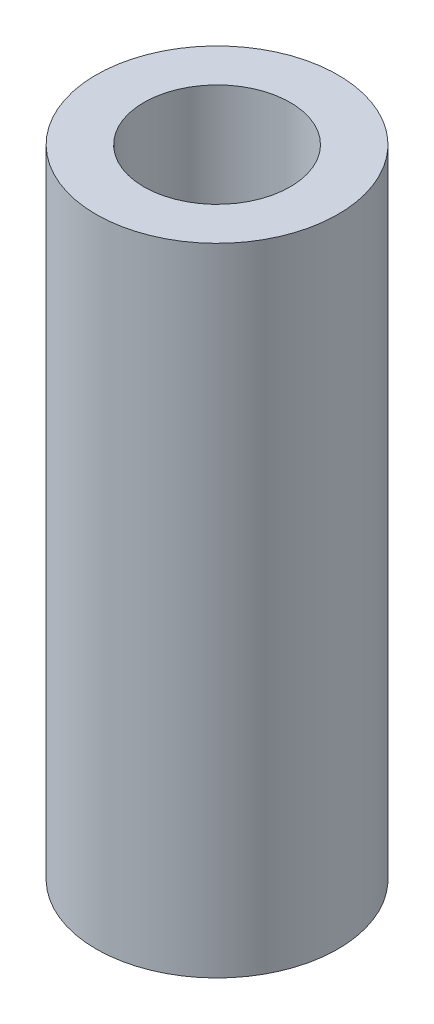
ISO-10303-21;
HEADER;
FILE_DESCRIPTION(('STEP AP214'),'2;1');
FILE_NAME('part.step','',(''),(''),'','','');
FILE_SCHEMA(('AUTOMOTIVE_DESIGN { 1 0 10303 214 1 1 1 1 }'));
ENDSEC;
DATA;
#1=APPLICATION_CONTEXT('core data for automotive mechanical design processes');
#2=APPLICATION_PROTOCOL_DEFINITION('international standard','automotive_design',2000,#1);
#3=PRODUCT_CONTEXT('',#1,'mechanical');
#4=PRODUCT('Part','Part','',(#3));
#5=PRODUCT_RELATED_PRODUCT_CATEGORY('part','',(#4));
#6=PRODUCT_DEFINITION_FORMATION('','',#4);
#7=PRODUCT_DEFINITION_CONTEXT('part definition',#1,'design');
#8=PRODUCT_DEFINITION('design','',#6,#7);
#9=PRODUCT_DEFINITION_SHAPE('','',#8);
#10=(LENGTH_UNIT() NAMED_UNIT(*) SI_UNIT(.MILLI.,.METRE.));
#11=(NAMED_UNIT(*) PLANE_ANGLE_UNIT() SI_UNIT($,.RADIAN.));
#12=(NAMED_UNIT(*) SI_UNIT($,.STERADIAN.) SOLID_ANGLE_UNIT());
#13=UNCERTAINTY_MEASURE_WITH_UNIT(LENGTH_MEASURE(1.E-05),#10,'distance_accuracy_value','');
#14=(GEOMETRIC_REPRESENTATION_CONTEXT(3) GLOBAL_UNCERTAINTY_ASSIGNED_CONTEXT((#13)) GLOBAL_UNIT_ASSIGNED_CONTEXT((#10,
#11,#12)) REPRESENTATION_CONTEXT('',''));
#15=CARTESIAN_POINT('',(0.,0.,0.));
#16=DIRECTION('',(0.,0.,1.));
#17=DIRECTION('',(1.,0.,0.));
#18=AXIS2_PLACEMENT_3D('',#15,#16,#17);
#19=CARTESIAN_POINT('',(0.,20.,0.));
#20=DIRECTION('',(0.,1.,0.));
#21=DIRECTION('',(0.,0.,1.));
#22=AXIS2_PLACEMENT_3D('',#19,#20,#21);
#23=PLANE('',#22);
#24=CARTESIAN_POINT('',(0.,20.,0.));
#25=DIRECTION('',(0.,1.,0.));
#26=DIRECTION('',(0.,0.,1.));
#27=AXIS2_PLACEMENT_3D('',#24,#25,#26);
#28=CIRCLE('',#27,3.8);
#29=CARTESIAN_POINT('',(0.,20.,3.8));
#30=VERTEX_POINT('',#29);
#31=EDGE_CURVE('E10',#30,#30,#28,.T.);
#32=ORIENTED_EDGE('',*,*,#31,.T.);
#33=EDGE_LOOP('',(#32));
#34=FACE_BOUND('',#33,.T.);
#35=CARTESIAN_POINT('',(0.,20.,0.));
#36=DIRECTION('',(0.,1.,0.));
#37=DIRECTION('',(0.,0.,1.));
#38=AXIS2_PLACEMENT_3D('',#35,#36,#37);
#39=CIRCLE('',#38,2.3);
#40=CARTESIAN_POINT('',(0.,20.,2.3));
#41=VERTEX_POINT('',#40);
#42=EDGE_CURVE('E50',#41,#41,#39,.T.);
#43=ORIENTED_EDGE('',*,*,#42,.F.);
#44=EDGE_LOOP('',(#43));
#45=FACE_BOUND('',#44,.T.);
#46=ADVANCED_FACE('F39',(#34,#45),#23,.T.);
#47=CARTESIAN_POINT('',(0.,0.,0.));
#48=DIRECTION('',(0.,1.,0.));
#49=DIRECTION('',(0.,0.,1.));
#50=AXIS2_PLACEMENT_3D('',#47,#48,#49);
#51=PLANE('',#50);
#52=CARTESIAN_POINT('',(0.,0.,0.));
#53=DIRECTION('',(0.,1.,0.));
#54=DIRECTION('',(0.,0.,1.));
#55=AXIS2_PLACEMENT_3D('',#52,#53,#54);
#56=CIRCLE('',#55,3.8);
#57=CARTESIAN_POINT('',(0.,0.,3.8));
#58=VERTEX_POINT('',#57);
#59=EDGE_CURVE('E43',#58,#58,#56,.T.);
#60=ORIENTED_EDGE('',*,*,#59,.F.);
#61=EDGE_LOOP('',(#60));
#62=FACE_BOUND('',#61,.T.);
#63=CARTESIAN_POINT('',(0.,0.,0.));
#64=DIRECTION('',(0.,1.,0.));
#65=DIRECTION('',(0.,0.,1.));
#66=AXIS2_PLACEMENT_3D('',#63,#64,#65);
#67=CIRCLE('',#66,2.3);
#68=CARTESIAN_POINT('',(0.,0.,2.3));
#69=VERTEX_POINT('',#68);
#70=EDGE_CURVE('E52',#69,#69,#67,.T.);
#71=ORIENTED_EDGE('',*,*,#70,.T.);
#72=EDGE_LOOP('',(#71));
#73=FACE_BOUND('',#72,.T.);
#74=ADVANCED_FACE('F62',(#62,#73),#51,.F.);
#75=CARTESIAN_POINT('',(0.,20.,0.));
#76=DIRECTION('',(0.,-1.,0.));
#77=DIRECTION('',(0.,0.,-1.));
#78=AXIS2_PLACEMENT_3D('',#75,#76,#77);
#79=CYLINDRICAL_SURFACE('',#78,3.8);
#80=ORIENTED_EDGE('',*,*,#31,.F.);
#81=EDGE_LOOP('',(#80));
#82=FACE_BOUND('',#81,.T.);
#83=ORIENTED_EDGE('',*,*,#59,.T.);
#84=EDGE_LOOP('',(#83));
#85=FACE_BOUND('',#84,.T.);
#86=ADVANCED_FACE('F41',(#82,#85),#79,.T.);
#87=CARTESIAN_POINT('',(0.,20.,0.));
#88=DIRECTION('',(0.,-1.,0.));
#89=DIRECTION('',(0.,0.,-1.));
#90=AXIS2_PLACEMENT_3D('',#87,#88,#89);
#91=CYLINDRICAL_SURFACE('',#90,2.3);
#92=ORIENTED_EDGE('',*,*,#42,.T.);
#93=EDGE_LOOP('',(#92));
#94=FACE_BOUND('',#93,.T.);
#95=ORIENTED_EDGE('',*,*,#70,.F.);
#96=EDGE_LOOP('',(#95));
#97=FACE_BOUND('',#96,.T.);
#98=ADVANCED_FACE('F58',(#94,#97),#91,.F.);
#99=CLOSED_SHELL('',(#46,#74,#86,#98));
#100=MANIFOLD_SOLID_BREP('B2',#99);
#101=ADVANCED_BREP_SHAPE_REPRESENTATION('',(#18,#100),#14);
#102=SHAPE_DEFINITION_REPRESENTATION(#9,#101);
ENDSEC;
END-ISO-10303-21;
